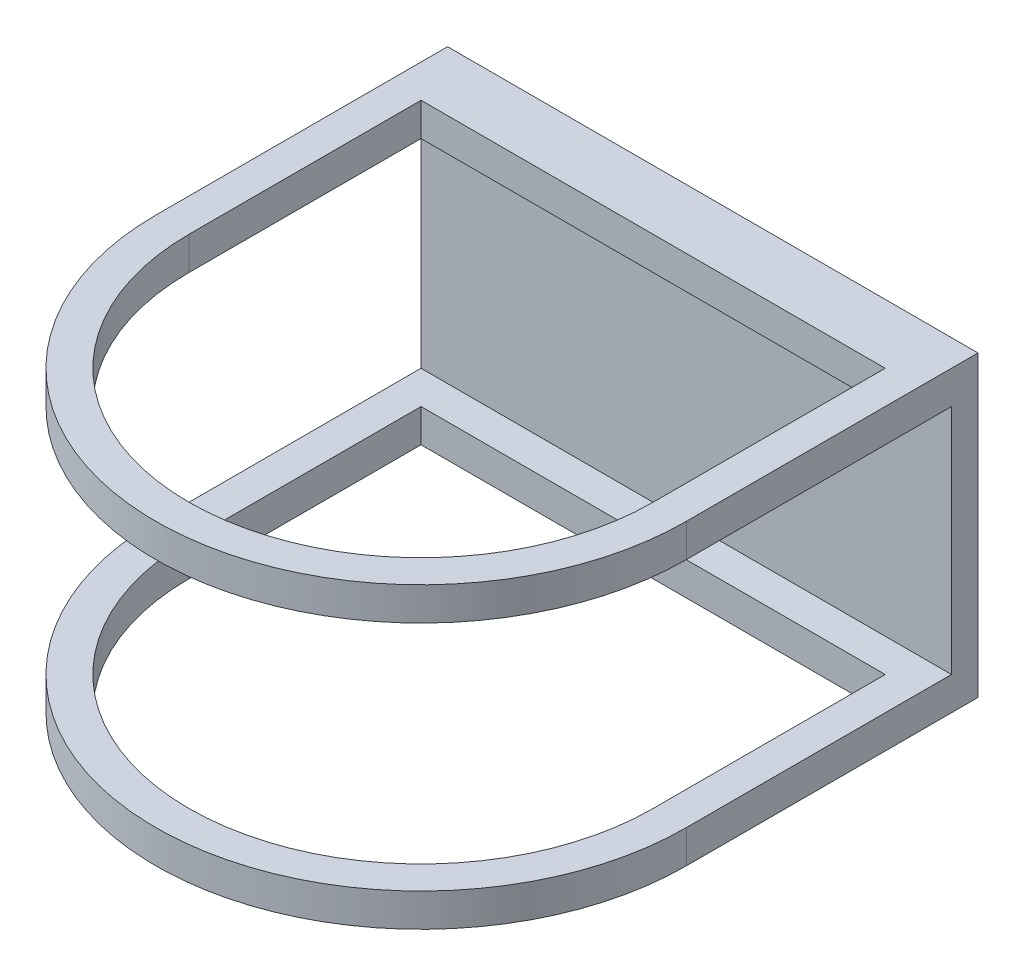
ISO-10303-21;
HEADER;
FILE_DESCRIPTION(('STEP AP214'),'2;1');
FILE_NAME('part.step','',(''),(''),'','','');
FILE_SCHEMA(('AUTOMOTIVE_DESIGN { 1 0 10303 214 1 1 1 1 }'));
ENDSEC;
DATA;
#1=APPLICATION_CONTEXT('core data for automotive mechanical design processes');
#2=APPLICATION_PROTOCOL_DEFINITION('international standard','automotive_design',2000,#1);
#3=PRODUCT_CONTEXT('',#1,'mechanical');
#4=PRODUCT('Part','Part','',(#3));
#5=PRODUCT_RELATED_PRODUCT_CATEGORY('part','',(#4));
#6=PRODUCT_DEFINITION_FORMATION('','',#4);
#7=PRODUCT_DEFINITION_CONTEXT('part definition',#1,'design');
#8=PRODUCT_DEFINITION('design','',#6,#7);
#9=PRODUCT_DEFINITION_SHAPE('','',#8);
#10=(LENGTH_UNIT() NAMED_UNIT(*) SI_UNIT(.MILLI.,.METRE.));
#11=(NAMED_UNIT(*) PLANE_ANGLE_UNIT() SI_UNIT($,.RADIAN.));
#12=(NAMED_UNIT(*) SI_UNIT($,.STERADIAN.) SOLID_ANGLE_UNIT());
#13=UNCERTAINTY_MEASURE_WITH_UNIT(LENGTH_MEASURE(1.E-05),#10,'distance_accuracy_value','');
#14=(GEOMETRIC_REPRESENTATION_CONTEXT(3) GLOBAL_UNCERTAINTY_ASSIGNED_CONTEXT((#13)) GLOBAL_UNIT_ASSIGNED_CONTEXT((#10,
#11,#12)) REPRESENTATION_CONTEXT('',''));
#15=CARTESIAN_POINT('',(0.,0.,0.));
#16=DIRECTION('',(0.,0.,1.));
#17=DIRECTION('',(1.,0.,0.));
#18=AXIS2_PLACEMENT_3D('',#15,#16,#17);
#19=CARTESIAN_POINT('',(0.,0.,-50.8));
#20=DIRECTION('',(0.,0.,-1.));
#21=DIRECTION('',(-1.,0.,0.));
#22=AXIS2_PLACEMENT_3D('',#19,#20,#21);
#23=PLANE('',#22);
#24=DIRECTION('',(1.,0.,0.));
#25=VECTOR('',#24,1.);
#26=CARTESIAN_POINT('',(0.,50.8,-50.8));
#27=LINE('',#26,#25);
#28=CARTESIAN_POINT('',(-50.8,50.8,-50.8));
#29=VERTEX_POINT('',#28);
#30=CARTESIAN_POINT('',(50.8,50.8,-50.8));
#31=VERTEX_POINT('',#30);
#32=EDGE_CURVE('E248',#29,#31,#27,.T.);
#33=ORIENTED_EDGE('',*,*,#32,.F.);
#34=DIRECTION('',(0.,1.,0.));
#35=VECTOR('',#34,1.);
#36=CARTESIAN_POINT('',(-50.8,0.,-50.8));
#37=LINE('',#36,#35);
#38=CARTESIAN_POINT('',(-50.8,6.35,-50.8));
#39=VERTEX_POINT('',#38);
#40=EDGE_CURVE('E193',#39,#29,#37,.T.);
#41=ORIENTED_EDGE('',*,*,#40,.F.);
#42=DIRECTION('',(1.,0.,0.));
#43=VECTOR('',#42,1.);
#44=CARTESIAN_POINT('',(0.,6.35,-50.8));
#45=LINE('',#44,#43);
#46=CARTESIAN_POINT('',(50.8,6.35,-50.8));
#47=VERTEX_POINT('',#46);
#48=EDGE_CURVE('E116',#39,#47,#45,.T.);
#49=ORIENTED_EDGE('',*,*,#48,.T.);
#50=DIRECTION('',(0.,-1.,0.));
#51=VECTOR('',#50,1.);
#52=CARTESIAN_POINT('',(50.8,57.15,-50.8));
#53=LINE('',#52,#51);
#54=EDGE_CURVE('E38',#31,#47,#53,.T.);
#55=ORIENTED_EDGE('',*,*,#54,.F.);
#56=EDGE_LOOP('',(#33,#41,#49,#55));
#57=FACE_BOUND('',#56,.T.);
#58=ADVANCED_FACE('F34',(#57),#23,.F.);
#59=CARTESIAN_POINT('',(0.,0.,-55.88));
#60=DIRECTION('',(0.,0.,-1.));
#61=DIRECTION('',(-1.,0.,0.));
#62=AXIS2_PLACEMENT_3D('',#59,#60,#61);
#63=PLANE('',#62);
#64=CARTESIAN_POINT('',(47.625,53.975,-55.88));
#65=DIRECTION('',(0.,0.,-1.));
#66=DIRECTION('',(-1.,0.,0.));
#67=AXIS2_PLACEMENT_3D('',#64,#65,#66);
#68=CIRCLE('',#67,2.413);
#69=CARTESIAN_POINT('',(45.212,53.975,-55.88));
#70=VERTEX_POINT('',#69);
#71=EDGE_CURVE('E223',#70,#70,#68,.T.);
#72=ORIENTED_EDGE('',*,*,#71,.F.);
#73=EDGE_LOOP('',(#72));
#74=FACE_BOUND('',#73,.T.);
#75=DIRECTION('',(1.,0.,0.));
#76=VECTOR('',#75,1.);
#77=CARTESIAN_POINT('',(-50.8,57.15,-55.88));
#78=LINE('',#77,#76);
#79=CARTESIAN_POINT('',(-50.8,57.15,-55.88));
#80=VERTEX_POINT('',#79);
#81=CARTESIAN_POINT('',(50.8,57.15,-55.88));
#82=VERTEX_POINT('',#81);
#83=EDGE_CURVE('E196',#80,#82,#78,.T.);
#84=ORIENTED_EDGE('',*,*,#83,.T.);
#85=DIRECTION('',(0.,-1.,0.));
#86=VECTOR('',#85,1.);
#87=CARTESIAN_POINT('',(50.8,57.15,-55.88));
#88=LINE('',#87,#86);
#89=CARTESIAN_POINT('',(50.8,0.,-55.88));
#90=VERTEX_POINT('',#89);
#91=EDGE_CURVE('E217',#82,#90,#88,.T.);
#92=ORIENTED_EDGE('',*,*,#91,.T.);
#93=DIRECTION('',(-1.,0.,0.));
#94=VECTOR('',#93,1.);
#95=CARTESIAN_POINT('',(50.8,0.,-55.88));
#96=LINE('',#95,#94);
#97=CARTESIAN_POINT('',(-50.8,0.,-55.88));
#98=VERTEX_POINT('',#97);
#99=EDGE_CURVE('E212',#90,#98,#96,.T.);
#100=ORIENTED_EDGE('',*,*,#99,.T.);
#101=DIRECTION('',(0.,1.,0.));
#102=VECTOR('',#101,1.);
#103=CARTESIAN_POINT('',(-50.8,0.,-55.88));
#104=LINE('',#103,#102);
#105=EDGE_CURVE('E203',#98,#80,#104,.T.);
#106=ORIENTED_EDGE('',*,*,#105,.T.);
#107=EDGE_LOOP('',(#84,#92,#100,#106));
#108=FACE_BOUND('',#107,.T.);
#109=CARTESIAN_POINT('',(-47.625,53.975,-55.88));
#110=DIRECTION('',(0.,0.,-1.));
#111=DIRECTION('',(-1.,0.,0.));
#112=AXIS2_PLACEMENT_3D('',#109,#110,#111);
#113=CIRCLE('',#112,2.413);
#114=CARTESIAN_POINT('',(-50.038,53.975,-55.88));
#115=VERTEX_POINT('',#114);
#116=EDGE_CURVE('E226',#115,#115,#113,.T.);
#117=ORIENTED_EDGE('',*,*,#116,.F.);
#118=EDGE_LOOP('',(#117));
#119=FACE_BOUND('',#118,.T.);
#120=ADVANCED_FACE('F306',(#74,#108,#119),#63,.T.);
#121=CARTESIAN_POINT('',(-50.8,57.15,-55.88));
#122=DIRECTION('',(0.,-1.,0.));
#123=DIRECTION('',(0.,0.,-1.));
#124=AXIS2_PLACEMENT_3D('',#121,#122,#123);
#125=PLANE('',#124);
#126=DIRECTION('',(0.,0.,1.));
#127=VECTOR('',#126,1.);
#128=CARTESIAN_POINT('',(-50.8,57.15,-55.88));
#129=LINE('',#128,#127);
#130=CARTESIAN_POINT('',(-50.8,57.15,0.));
#131=VERTEX_POINT('',#130);
#132=EDGE_CURVE('E201',#80,#131,#129,.T.);
#133=ORIENTED_EDGE('',*,*,#132,.T.);
#134=CARTESIAN_POINT('',(0.,57.15,0.));
#135=DIRECTION('',(0.,1.,0.));
#136=DIRECTION('',(0.,0.,1.));
#137=AXIS2_PLACEMENT_3D('',#134,#135,#136);
#138=CIRCLE('',#137,50.8);
#139=CARTESIAN_POINT('',(50.8,57.15,0.));
#140=VERTEX_POINT('',#139);
#141=EDGE_CURVE('E243',#131,#140,#138,.T.);
#142=ORIENTED_EDGE('',*,*,#141,.T.);
#143=DIRECTION('',(0.,0.,1.));
#144=VECTOR('',#143,1.);
#145=CARTESIAN_POINT('',(50.8,57.15,-55.88));
#146=LINE('',#145,#144);
#147=EDGE_CURVE('E188',#82,#140,#146,.T.);
#148=ORIENTED_EDGE('',*,*,#147,.F.);
#149=ORIENTED_EDGE('',*,*,#83,.F.);
#150=EDGE_LOOP('',(#133,#142,#148,#149));
#151=FACE_BOUND('',#150,.T.);
#152=CARTESIAN_POINT('',(0.,57.15,0.));
#153=DIRECTION('',(0.,1.,0.));
#154=DIRECTION('',(0.,0.,1.));
#155=AXIS2_PLACEMENT_3D('',#152,#153,#154);
#156=CIRCLE('',#155,44.45);
#157=CARTESIAN_POINT('',(-44.45,57.15,0.));
#158=VERTEX_POINT('',#157);
#159=CARTESIAN_POINT('',(44.45,57.15,0.));
#160=VERTEX_POINT('',#159);
#161=EDGE_CURVE('E251',#158,#160,#156,.T.);
#162=ORIENTED_EDGE('',*,*,#161,.F.);
#163=DIRECTION('',(0.,0.,-1.));
#164=VECTOR('',#163,1.);
#165=CARTESIAN_POINT('',(-44.45,57.15,0.));
#166=LINE('',#165,#164);
#167=CARTESIAN_POINT('',(-44.45,57.15,-44.45));
#168=VERTEX_POINT('',#167);
#169=EDGE_CURVE('E281',#158,#168,#166,.T.);
#170=ORIENTED_EDGE('',*,*,#169,.T.);
#171=DIRECTION('',(1.,0.,0.));
#172=VECTOR('',#171,1.);
#173=CARTESIAN_POINT('',(0.,57.15,-44.45));
#174=LINE('',#173,#172);
#175=CARTESIAN_POINT('',(44.45,57.15,-44.45));
#176=VERTEX_POINT('',#175);
#177=EDGE_CURVE('E278',#168,#176,#174,.T.);
#178=ORIENTED_EDGE('',*,*,#177,.T.);
#179=DIRECTION('',(0.,0.,1.));
#180=VECTOR('',#179,1.);
#181=CARTESIAN_POINT('',(44.45,57.15,0.));
#182=LINE('',#181,#180);
#183=EDGE_CURVE('E275',#176,#160,#182,.T.);
#184=ORIENTED_EDGE('',*,*,#183,.T.);
#185=EDGE_LOOP('',(#162,#170,#178,#184));
#186=FACE_BOUND('',#185,.T.);
#187=ADVANCED_FACE('F297',(#151,#186),#125,.F.);
#188=CARTESIAN_POINT('',(47.625,53.975,-55.88));
#189=DIRECTION('',(0.,0.,1.));
#190=DIRECTION('',(1.,0.,0.));
#191=AXIS2_PLACEMENT_3D('',#188,#189,#190);
#192=CYLINDRICAL_SURFACE('',#191,2.413);
#193=ORIENTED_EDGE('',*,*,#71,.T.);
#194=EDGE_LOOP('',(#193));
#195=FACE_BOUND('',#194,.T.);
#196=CARTESIAN_POINT('',(47.625,53.975,-25.4));
#197=DIRECTION('',(0.,0.,-1.));
#198=DIRECTION('',(-1.,0.,0.));
#199=AXIS2_PLACEMENT_3D('',#196,#197,#198);
#200=CIRCLE('',#199,2.41300000000001);
#201=CARTESIAN_POINT('',(45.212,53.975,-25.4));
#202=VERTEX_POINT('',#201);
#203=EDGE_CURVE('E288',#202,#202,#200,.T.);
#204=ORIENTED_EDGE('',*,*,#203,.F.);
#205=EDGE_LOOP('',(#204));
#206=FACE_BOUND('',#205,.T.);
#207=ADVANCED_FACE('F294',(#195,#206),#192,.F.);
#208=CARTESIAN_POINT('',(-47.625,53.975,-55.88));
#209=DIRECTION('',(0.,0.,1.));
#210=DIRECTION('',(1.,0.,0.));
#211=AXIS2_PLACEMENT_3D('',#208,#209,#210);
#212=CYLINDRICAL_SURFACE('',#211,2.413);
#213=ORIENTED_EDGE('',*,*,#116,.T.);
#214=EDGE_LOOP('',(#213));
#215=FACE_BOUND('',#214,.T.);
#216=CARTESIAN_POINT('',(-47.625,53.975,-25.4));
#217=DIRECTION('',(0.,0.,-1.));
#218=DIRECTION('',(-1.,0.,0.));
#219=AXIS2_PLACEMENT_3D('',#216,#217,#218);
#220=CIRCLE('',#219,2.41300000000001);
#221=CARTESIAN_POINT('',(-50.038,53.975,-25.4));
#222=VERTEX_POINT('',#221);
#223=EDGE_CURVE('E273',#222,#222,#220,.T.);
#224=ORIENTED_EDGE('',*,*,#223,.F.);
#225=EDGE_LOOP('',(#224));
#226=FACE_BOUND('',#225,.T.);
#227=ADVANCED_FACE('F296',(#215,#226),#212,.F.);
#228=CARTESIAN_POINT('',(0.,6.35,0.));
#229=DIRECTION('',(0.,-1.,0.));
#230=DIRECTION('',(0.,0.,-1.));
#231=AXIS2_PLACEMENT_3D('',#228,#229,#230);
#232=CYLINDRICAL_SURFACE('',#231,50.8);
#233=CARTESIAN_POINT('',(0.,0.,0.));
#234=DIRECTION('',(0.,1.,0.));
#235=DIRECTION('',(0.,0.,1.));
#236=AXIS2_PLACEMENT_3D('',#233,#234,#235);
#237=CIRCLE('',#236,50.8);
#238=CARTESIAN_POINT('',(-50.8,0.,0.));
#239=VERTEX_POINT('',#238);
#240=CARTESIAN_POINT('',(50.8,0.,0.));
#241=VERTEX_POINT('',#240);
#242=EDGE_CURVE('E145',#239,#241,#237,.T.);
#243=ORIENTED_EDGE('',*,*,#242,.T.);
#244=DIRECTION('',(0.,-1.,0.));
#245=VECTOR('',#244,1.);
#246=CARTESIAN_POINT('',(50.8,6.35,0.));
#247=LINE('',#246,#245);
#248=CARTESIAN_POINT('',(50.8,6.35,0.));
#249=VERTEX_POINT('',#248);
#250=EDGE_CURVE('E46',#249,#241,#247,.T.);
#251=ORIENTED_EDGE('',*,*,#250,.F.);
#252=CARTESIAN_POINT('',(0.,6.35,0.));
#253=DIRECTION('',(0.,1.,0.));
#254=DIRECTION('',(0.,0.,1.));
#255=AXIS2_PLACEMENT_3D('',#252,#253,#254);
#256=CIRCLE('',#255,50.8);
#257=CARTESIAN_POINT('',(-50.8,6.35,0.));
#258=VERTEX_POINT('',#257);
#259=EDGE_CURVE('E108',#258,#249,#256,.T.);
#260=ORIENTED_EDGE('',*,*,#259,.F.);
#261=DIRECTION('',(0.,-1.,0.));
#262=VECTOR('',#261,1.);
#263=CARTESIAN_POINT('',(-50.8,6.35,0.));
#264=LINE('',#263,#262);
#265=EDGE_CURVE('E11',#258,#239,#264,.T.);
#266=ORIENTED_EDGE('',*,*,#265,.T.);
#267=EDGE_LOOP('',(#243,#251,#260,#266));
#268=FACE_BOUND('',#267,.T.);
#269=ADVANCED_FACE('F109',(#268),#232,.T.);
#270=CARTESIAN_POINT('',(44.45,6.35,0.));
#271=DIRECTION('',(1.,0.,0.));
#272=DIRECTION('',(0.,0.,-1.));
#273=AXIS2_PLACEMENT_3D('',#270,#271,#272);
#274=PLANE('',#273);
#275=DIRECTION('',(0.,0.,1.));
#276=VECTOR('',#275,1.);
#277=CARTESIAN_POINT('',(44.45,0.,0.));
#278=LINE('',#277,#276);
#279=CARTESIAN_POINT('',(44.45,0.,-44.45));
#280=VERTEX_POINT('',#279);
#281=CARTESIAN_POINT('',(44.45,0.,0.));
#282=VERTEX_POINT('',#281);
#283=EDGE_CURVE('E141',#280,#282,#278,.T.);
#284=ORIENTED_EDGE('',*,*,#283,.T.);
#285=DIRECTION('',(0.,-1.,0.));
#286=VECTOR('',#285,1.);
#287=CARTESIAN_POINT('',(44.45,6.35,0.));
#288=LINE('',#287,#286);
#289=CARTESIAN_POINT('',(44.45,6.35,0.));
#290=VERTEX_POINT('',#289);
#291=EDGE_CURVE('E129',#290,#282,#288,.T.);
#292=ORIENTED_EDGE('',*,*,#291,.F.);
#293=DIRECTION('',(0.,0.,1.));
#294=VECTOR('',#293,1.);
#295=CARTESIAN_POINT('',(44.45,6.35,0.));
#296=LINE('',#295,#294);
#297=CARTESIAN_POINT('',(44.45,6.35,-44.45));
#298=VERTEX_POINT('',#297);
#299=EDGE_CURVE('E118',#298,#290,#296,.T.);
#300=ORIENTED_EDGE('',*,*,#299,.F.);
#301=DIRECTION('',(0.,-1.,0.));
#302=VECTOR('',#301,1.);
#303=CARTESIAN_POINT('',(44.45,6.35,-44.45));
#304=LINE('',#303,#302);
#305=EDGE_CURVE('E153',#298,#280,#304,.T.);
#306=ORIENTED_EDGE('',*,*,#305,.T.);
#307=EDGE_LOOP('',(#284,#292,#300,#306));
#308=FACE_BOUND('',#307,.T.);
#309=ADVANCED_FACE('F173',(#308),#274,.F.);
#310=CARTESIAN_POINT('',(0.,6.35,-44.45));
#311=DIRECTION('',(0.,0.,-1.));
#312=DIRECTION('',(-1.,0.,0.));
#313=AXIS2_PLACEMENT_3D('',#310,#311,#312);
#314=PLANE('',#313);
#315=DIRECTION('',(1.,0.,0.));
#316=VECTOR('',#315,1.);
#317=CARTESIAN_POINT('',(0.,0.,-44.45));
#318=LINE('',#317,#316);
#319=CARTESIAN_POINT('',(-44.45,0.,-44.45));
#320=VERTEX_POINT('',#319);
#321=EDGE_CURVE('E139',#320,#280,#318,.T.);
#322=ORIENTED_EDGE('',*,*,#321,.T.);
#323=ORIENTED_EDGE('',*,*,#305,.F.);
#324=DIRECTION('',(1.,0.,0.));
#325=VECTOR('',#324,1.);
#326=CARTESIAN_POINT('',(0.,6.35,-44.45));
#327=LINE('',#326,#325);
#328=CARTESIAN_POINT('',(-44.45,6.35,-44.45));
#329=VERTEX_POINT('',#328);
#330=EDGE_CURVE('E120',#329,#298,#327,.T.);
#331=ORIENTED_EDGE('',*,*,#330,.F.);
#332=DIRECTION('',(0.,-1.,0.));
#333=VECTOR('',#332,1.);
#334=CARTESIAN_POINT('',(-44.45,6.35,-44.45));
#335=LINE('',#334,#333);
#336=EDGE_CURVE('E155',#329,#320,#335,.T.);
#337=ORIENTED_EDGE('',*,*,#336,.T.);
#338=EDGE_LOOP('',(#322,#323,#331,#337));
#339=FACE_BOUND('',#338,.T.);
#340=ADVANCED_FACE('F175',(#339),#314,.F.);
#341=CARTESIAN_POINT('',(-44.45,6.35,0.));
#342=DIRECTION('',(-1.,0.,0.));
#343=DIRECTION('',(0.,0.,1.));
#344=AXIS2_PLACEMENT_3D('',#341,#342,#343);
#345=PLANE('',#344);
#346=DIRECTION('',(0.,0.,-1.));
#347=VECTOR('',#346,1.);
#348=CARTESIAN_POINT('',(-44.45,0.,0.));
#349=LINE('',#348,#347);
#350=CARTESIAN_POINT('',(-44.45,0.,0.));
#351=VERTEX_POINT('',#350);
#352=EDGE_CURVE('E136',#351,#320,#349,.T.);
#353=ORIENTED_EDGE('',*,*,#352,.T.);
#354=ORIENTED_EDGE('',*,*,#336,.F.);
#355=DIRECTION('',(0.,0.,-1.));
#356=VECTOR('',#355,1.);
#357=CARTESIAN_POINT('',(-44.45,6.35,0.));
#358=LINE('',#357,#356);
#359=CARTESIAN_POINT('',(-44.45,6.35,0.));
#360=VERTEX_POINT('',#359);
#361=EDGE_CURVE('E164',#360,#329,#358,.T.);
#362=ORIENTED_EDGE('',*,*,#361,.F.);
#363=DIRECTION('',(0.,-1.,0.));
#364=VECTOR('',#363,1.);
#365=CARTESIAN_POINT('',(-44.45,6.35,0.));
#366=LINE('',#365,#364);
#367=EDGE_CURVE('E91',#360,#351,#366,.T.);
#368=ORIENTED_EDGE('',*,*,#367,.T.);
#369=EDGE_LOOP('',(#353,#354,#362,#368));
#370=FACE_BOUND('',#369,.T.);
#371=ADVANCED_FACE('F163',(#370),#345,.F.);
#372=CARTESIAN_POINT('',(0.,6.35,0.));
#373=DIRECTION('',(0.,-1.,0.));
#374=DIRECTION('',(0.,0.,-1.));
#375=AXIS2_PLACEMENT_3D('',#372,#373,#374);
#376=CYLINDRICAL_SURFACE('',#375,44.45);
#377=CARTESIAN_POINT('',(0.,0.,0.));
#378=DIRECTION('',(0.,1.,0.));
#379=DIRECTION('',(0.,0.,1.));
#380=AXIS2_PLACEMENT_3D('',#377,#378,#379);
#381=CIRCLE('',#380,44.45);
#382=EDGE_CURVE('E133',#351,#282,#381,.T.);
#383=ORIENTED_EDGE('',*,*,#382,.F.);
#384=ORIENTED_EDGE('',*,*,#367,.F.);
#385=CARTESIAN_POINT('',(0.,6.35,0.));
#386=DIRECTION('',(0.,1.,0.));
#387=DIRECTION('',(0.,0.,1.));
#388=AXIS2_PLACEMENT_3D('',#385,#386,#387);
#389=CIRCLE('',#388,44.45);
#390=EDGE_CURVE('E150',#360,#290,#389,.T.);
#391=ORIENTED_EDGE('',*,*,#390,.T.);
#392=ORIENTED_EDGE('',*,*,#291,.T.);
#393=EDGE_LOOP('',(#383,#384,#391,#392));
#394=FACE_BOUND('',#393,.T.);
#395=ADVANCED_FACE('F36',(#394),#376,.F.);
#396=CARTESIAN_POINT('',(0.,6.35,0.));
#397=DIRECTION('',(0.,1.,0.));
#398=DIRECTION('',(0.,0.,1.));
#399=AXIS2_PLACEMENT_3D('',#396,#397,#398);
#400=PLANE('',#399);
#401=ORIENTED_EDGE('',*,*,#390,.F.);
#402=ORIENTED_EDGE('',*,*,#361,.T.);
#403=ORIENTED_EDGE('',*,*,#330,.T.);
#404=ORIENTED_EDGE('',*,*,#299,.T.);
#405=EDGE_LOOP('',(#401,#402,#403,#404));
#406=FACE_BOUND('',#405,.T.);
#407=DIRECTION('',(0.,0.,-1.));
#408=VECTOR('',#407,1.);
#409=CARTESIAN_POINT('',(-50.8,6.35,0.));
#410=LINE('',#409,#408);
#411=EDGE_CURVE('E55',#258,#39,#410,.T.);
#412=ORIENTED_EDGE('',*,*,#411,.F.);
#413=ORIENTED_EDGE('',*,*,#259,.T.);
#414=DIRECTION('',(0.,0.,1.));
#415=VECTOR('',#414,1.);
#416=CARTESIAN_POINT('',(50.8,6.35,0.));
#417=LINE('',#416,#415);
#418=EDGE_CURVE('E112',#47,#249,#417,.T.);
#419=ORIENTED_EDGE('',*,*,#418,.F.);
#420=ORIENTED_EDGE('',*,*,#48,.F.);
#421=EDGE_LOOP('',(#412,#413,#419,#420));
#422=FACE_BOUND('',#421,.T.);
#423=ADVANCED_FACE('F114',(#406,#422),#400,.T.);
#424=CARTESIAN_POINT('',(50.8,6.35,0.));
#425=DIRECTION('',(1.,0.,0.));
#426=DIRECTION('',(0.,0.,-1.));
#427=AXIS2_PLACEMENT_3D('',#424,#425,#426);
#428=PLANE('',#427);
#429=DIRECTION('',(0.,0.,1.));
#430=VECTOR('',#429,1.);
#431=CARTESIAN_POINT('',(50.8,0.,0.));
#432=LINE('',#431,#430);
#433=EDGE_CURVE('E147',#90,#241,#432,.T.);
#434=ORIENTED_EDGE('',*,*,#433,.F.);
#435=ORIENTED_EDGE('',*,*,#91,.F.);
#436=ORIENTED_EDGE('',*,*,#147,.T.);
#437=DIRECTION('',(0.,-1.,0.));
#438=VECTOR('',#437,1.);
#439=CARTESIAN_POINT('',(50.8,57.15,0.));
#440=LINE('',#439,#438);
#441=CARTESIAN_POINT('',(50.8,50.8,0.));
#442=VERTEX_POINT('',#441);
#443=EDGE_CURVE('E233',#140,#442,#440,.T.);
#444=ORIENTED_EDGE('',*,*,#443,.T.);
#445=DIRECTION('',(0.,0.,1.));
#446=VECTOR('',#445,1.);
#447=CARTESIAN_POINT('',(50.8,50.8,0.));
#448=LINE('',#447,#446);
#449=EDGE_CURVE('E252',#31,#442,#448,.T.);
#450=ORIENTED_EDGE('',*,*,#449,.F.);
#451=ORIENTED_EDGE('',*,*,#54,.T.);
#452=ORIENTED_EDGE('',*,*,#418,.T.);
#453=ORIENTED_EDGE('',*,*,#250,.T.);
#454=EDGE_LOOP('',(#434,#435,#436,#444,#450,#451,#452,#453));
#455=FACE_BOUND('',#454,.T.);
#456=ADVANCED_FACE('F347',(#455),#428,.T.);
#457=CARTESIAN_POINT('',(-50.8,6.35,0.));
#458=DIRECTION('',(-1.,0.,0.));
#459=DIRECTION('',(0.,0.,1.));
#460=AXIS2_PLACEMENT_3D('',#457,#458,#459);
#461=PLANE('',#460);
#462=DIRECTION('',(0.,0.,-1.));
#463=VECTOR('',#462,1.);
#464=CARTESIAN_POINT('',(-50.8,0.,0.));
#465=LINE('',#464,#463);
#466=EDGE_CURVE('E107',#239,#98,#465,.T.);
#467=ORIENTED_EDGE('',*,*,#466,.F.);
#468=ORIENTED_EDGE('',*,*,#265,.F.);
#469=ORIENTED_EDGE('',*,*,#411,.T.);
#470=ORIENTED_EDGE('',*,*,#40,.T.);
#471=DIRECTION('',(0.,0.,-1.));
#472=VECTOR('',#471,1.);
#473=CARTESIAN_POINT('',(-50.8,50.8,0.));
#474=LINE('',#473,#472);
#475=CARTESIAN_POINT('',(-50.8,50.8,0.));
#476=VERTEX_POINT('',#475);
#477=EDGE_CURVE('E258',#476,#29,#474,.T.);
#478=ORIENTED_EDGE('',*,*,#477,.F.);
#479=DIRECTION('',(0.,-1.,0.));
#480=VECTOR('',#479,1.);
#481=CARTESIAN_POINT('',(-50.8,57.15,0.));
#482=LINE('',#481,#480);
#483=EDGE_CURVE('E229',#131,#476,#482,.T.);
#484=ORIENTED_EDGE('',*,*,#483,.F.);
#485=ORIENTED_EDGE('',*,*,#132,.F.);
#486=ORIENTED_EDGE('',*,*,#105,.F.);
#487=EDGE_LOOP('',(#467,#468,#469,#470,#478,#484,#485,#486));
#488=FACE_BOUND('',#487,.T.);
#489=ADVANCED_FACE('F104',(#488),#461,.T.);
#490=CARTESIAN_POINT('',(0.,0.,0.));
#491=DIRECTION('',(0.,1.,0.));
#492=DIRECTION('',(0.,0.,1.));
#493=AXIS2_PLACEMENT_3D('',#490,#491,#492);
#494=PLANE('',#493);
#495=ORIENTED_EDGE('',*,*,#382,.T.);
#496=ORIENTED_EDGE('',*,*,#283,.F.);
#497=ORIENTED_EDGE('',*,*,#321,.F.);
#498=ORIENTED_EDGE('',*,*,#352,.F.);
#499=EDGE_LOOP('',(#495,#496,#497,#498));
#500=FACE_BOUND('',#499,.T.);
#501=ORIENTED_EDGE('',*,*,#466,.T.);
#502=ORIENTED_EDGE('',*,*,#99,.F.);
#503=ORIENTED_EDGE('',*,*,#433,.T.);
#504=ORIENTED_EDGE('',*,*,#242,.F.);
#505=EDGE_LOOP('',(#501,#502,#503,#504));
#506=FACE_BOUND('',#505,.T.);
#507=ADVANCED_FACE('F167',(#500,#506),#494,.F.);
#508=CARTESIAN_POINT('',(0.,50.8,0.));
#509=DIRECTION('',(0.,1.,0.));
#510=DIRECTION('',(0.,0.,1.));
#511=AXIS2_PLACEMENT_3D('',#508,#509,#510);
#512=PLANE('',#511);
#513=CARTESIAN_POINT('',(0.,50.8,0.));
#514=DIRECTION('',(0.,1.,0.));
#515=DIRECTION('',(0.,0.,1.));
#516=AXIS2_PLACEMENT_3D('',#513,#514,#515);
#517=CIRCLE('',#516,44.45);
#518=CARTESIAN_POINT('',(-44.45,50.8,0.));
#519=VERTEX_POINT('',#518);
#520=CARTESIAN_POINT('',(44.45,50.8,0.));
#521=VERTEX_POINT('',#520);
#522=EDGE_CURVE('E270',#519,#521,#517,.T.);
#523=ORIENTED_EDGE('',*,*,#522,.T.);
#524=DIRECTION('',(0.,0.,1.));
#525=VECTOR('',#524,1.);
#526=CARTESIAN_POINT('',(44.45,50.8,0.));
#527=LINE('',#526,#525);
#528=CARTESIAN_POINT('',(44.45,50.8,-44.45));
#529=VERTEX_POINT('',#528);
#530=EDGE_CURVE('E261',#529,#521,#527,.T.);
#531=ORIENTED_EDGE('',*,*,#530,.F.);
#532=DIRECTION('',(1.,0.,0.));
#533=VECTOR('',#532,1.);
#534=CARTESIAN_POINT('',(0.,50.8,-44.45));
#535=LINE('',#534,#533);
#536=CARTESIAN_POINT('',(-44.45,50.8,-44.45));
#537=VERTEX_POINT('',#536);
#538=EDGE_CURVE('E264',#537,#529,#535,.T.);
#539=ORIENTED_EDGE('',*,*,#538,.F.);
#540=DIRECTION('',(0.,0.,-1.));
#541=VECTOR('',#540,1.);
#542=CARTESIAN_POINT('',(-44.45,50.8,0.));
#543=LINE('',#542,#541);
#544=EDGE_CURVE('E267',#519,#537,#543,.T.);
#545=ORIENTED_EDGE('',*,*,#544,.F.);
#546=EDGE_LOOP('',(#523,#531,#539,#545));
#547=FACE_BOUND('',#546,.T.);
#548=ORIENTED_EDGE('',*,*,#477,.T.);
#549=ORIENTED_EDGE('',*,*,#32,.T.);
#550=ORIENTED_EDGE('',*,*,#449,.T.);
#551=CARTESIAN_POINT('',(0.,50.8,0.));
#552=DIRECTION('',(0.,1.,0.));
#553=DIRECTION('',(0.,0.,1.));
#554=AXIS2_PLACEMENT_3D('',#551,#552,#553);
#555=CIRCLE('',#554,50.8);
#556=EDGE_CURVE('E255',#476,#442,#555,.T.);
#557=ORIENTED_EDGE('',*,*,#556,.F.);
#558=EDGE_LOOP('',(#548,#549,#550,#557));
#559=FACE_BOUND('',#558,.T.);
#560=ADVANCED_FACE('F350',(#547,#559),#512,.F.);
#561=CARTESIAN_POINT('',(44.45,57.15,0.));
#562=DIRECTION('',(1.,0.,0.));
#563=DIRECTION('',(0.,0.,-1.));
#564=AXIS2_PLACEMENT_3D('',#561,#562,#563);
#565=PLANE('',#564);
#566=ORIENTED_EDGE('',*,*,#530,.T.);
#567=DIRECTION('',(0.,-1.,0.));
#568=VECTOR('',#567,1.);
#569=CARTESIAN_POINT('',(44.45,57.15,0.));
#570=LINE('',#569,#568);
#571=EDGE_CURVE('E240',#160,#521,#570,.T.);
#572=ORIENTED_EDGE('',*,*,#571,.F.);
#573=ORIENTED_EDGE('',*,*,#183,.F.);
#574=DIRECTION('',(0.,-1.,0.));
#575=VECTOR('',#574,1.);
#576=CARTESIAN_POINT('',(44.45,57.15,-44.45));
#577=LINE('',#576,#575);
#578=EDGE_CURVE('E237',#176,#529,#577,.T.);
#579=ORIENTED_EDGE('',*,*,#578,.T.);
#580=EDGE_LOOP('',(#566,#572,#573,#579));
#581=FACE_BOUND('',#580,.T.);
#582=ADVANCED_FACE('F390',(#581),#565,.F.);
#583=CARTESIAN_POINT('',(0.,57.15,-44.45));
#584=DIRECTION('',(0.,0.,-1.));
#585=DIRECTION('',(-1.,0.,0.));
#586=AXIS2_PLACEMENT_3D('',#583,#584,#585);
#587=PLANE('',#586);
#588=ORIENTED_EDGE('',*,*,#538,.T.);
#589=ORIENTED_EDGE('',*,*,#578,.F.);
#590=ORIENTED_EDGE('',*,*,#177,.F.);
#591=DIRECTION('',(0.,-1.,0.));
#592=VECTOR('',#591,1.);
#593=CARTESIAN_POINT('',(-44.45,57.15,-44.45));
#594=LINE('',#593,#592);
#595=EDGE_CURVE('E234',#168,#537,#594,.T.);
#596=ORIENTED_EDGE('',*,*,#595,.T.);
#597=EDGE_LOOP('',(#588,#589,#590,#596));
#598=FACE_BOUND('',#597,.T.);
#599=ADVANCED_FACE('F398',(#598),#587,.F.);
#600=CARTESIAN_POINT('',(-44.45,57.15,0.));
#601=DIRECTION('',(-1.,0.,0.));
#602=DIRECTION('',(0.,0.,1.));
#603=AXIS2_PLACEMENT_3D('',#600,#601,#602);
#604=PLANE('',#603);
#605=ORIENTED_EDGE('',*,*,#544,.T.);
#606=ORIENTED_EDGE('',*,*,#595,.F.);
#607=ORIENTED_EDGE('',*,*,#169,.F.);
#608=DIRECTION('',(0.,-1.,0.));
#609=VECTOR('',#608,1.);
#610=CARTESIAN_POINT('',(-44.45,57.15,0.));
#611=LINE('',#610,#609);
#612=EDGE_CURVE('E230',#158,#519,#611,.T.);
#613=ORIENTED_EDGE('',*,*,#612,.T.);
#614=EDGE_LOOP('',(#605,#606,#607,#613));
#615=FACE_BOUND('',#614,.T.);
#616=ADVANCED_FACE('F406',(#615),#604,.F.);
#617=CARTESIAN_POINT('',(0.,57.15,0.));
#618=DIRECTION('',(0.,-1.,0.));
#619=DIRECTION('',(0.,0.,-1.));
#620=AXIS2_PLACEMENT_3D('',#617,#618,#619);
#621=CYLINDRICAL_SURFACE('',#620,44.45);
#622=ORIENTED_EDGE('',*,*,#522,.F.);
#623=ORIENTED_EDGE('',*,*,#612,.F.);
#624=ORIENTED_EDGE('',*,*,#161,.T.);
#625=ORIENTED_EDGE('',*,*,#571,.T.);
#626=EDGE_LOOP('',(#622,#623,#624,#625));
#627=FACE_BOUND('',#626,.T.);
#628=ADVANCED_FACE('F414',(#627),#621,.F.);
#629=CARTESIAN_POINT('',(0.,57.15,0.));
#630=DIRECTION('',(0.,-1.,0.));
#631=DIRECTION('',(0.,0.,-1.));
#632=AXIS2_PLACEMENT_3D('',#629,#630,#631);
#633=CYLINDRICAL_SURFACE('',#632,50.8);
#634=ORIENTED_EDGE('',*,*,#556,.T.);
#635=ORIENTED_EDGE('',*,*,#443,.F.);
#636=ORIENTED_EDGE('',*,*,#141,.F.);
#637=ORIENTED_EDGE('',*,*,#483,.T.);
#638=EDGE_LOOP('',(#634,#635,#636,#637));
#639=FACE_BOUND('',#638,.T.);
#640=ADVANCED_FACE('F422',(#639),#633,.T.);
#641=CARTESIAN_POINT('',(-47.625,53.975,-25.4));
#642=DIRECTION('',(0.,0.,1.));
#643=DIRECTION('',(1.,0.,0.));
#644=AXIS2_PLACEMENT_3D('',#641,#642,#643);
#645=PLANE('',#644);
#646=ORIENTED_EDGE('',*,*,#223,.T.);
#647=EDGE_LOOP('',(#646));
#648=FACE_BOUND('',#647,.T.);
#649=ADVANCED_FACE('F430',(#648),#645,.F.);
#650=CARTESIAN_POINT('',(47.625,53.975,-25.4));
#651=DIRECTION('',(0.,0.,1.));
#652=DIRECTION('',(1.,0.,0.));
#653=AXIS2_PLACEMENT_3D('',#650,#651,#652);
#654=PLANE('',#653);
#655=ORIENTED_EDGE('',*,*,#203,.T.);
#656=EDGE_LOOP('',(#655));
#657=FACE_BOUND('',#656,.T.);
#658=ADVANCED_FACE('F292',(#657),#654,.F.);
#659=CLOSED_SHELL('',(#58,#120,#187,#207,#227,#269,#309,#340,#371,#395,#423,#456,#489,#507,#560,
#582,#599,#616,#628,#640,#649,#658));
#660=CARTESIAN_POINT('',(-47.625,3.175,-25.4));
#661=DIRECTION('',(0.,0.,1.));
#662=DIRECTION('',(1.,0.,0.));
#663=AXIS2_PLACEMENT_3D('',#660,#661,#662);
#664=PLANE('',#663);
#665=CARTESIAN_POINT('',(-47.625,3.175,-25.4));
#666=DIRECTION('',(0.,0.,-1.));
#667=DIRECTION('',(-1.,0.,0.));
#668=AXIS2_PLACEMENT_3D('',#665,#666,#667);
#669=CIRCLE('',#668,2.41300000000001);
#670=CARTESIAN_POINT('',(-50.038,3.175,-25.4));
#671=VERTEX_POINT('',#670);
#672=EDGE_CURVE('E137',#671,#671,#669,.T.);
#673=ORIENTED_EDGE('',*,*,#672,.T.);
#674=EDGE_LOOP('',(#673));
#675=FACE_BOUND('',#674,.T.);
#676=ADVANCED_FACE('F332',(#675),#664,.F.);
#677=CARTESIAN_POINT('',(-47.625,3.175,-50.8));
#678=DIRECTION('',(0.,0.,-1.));
#679=DIRECTION('',(-1.,0.,0.));
#680=AXIS2_PLACEMENT_3D('',#677,#678,#679);
#681=CYLINDRICAL_SURFACE('',#680,2.41300000000001);
#682=ORIENTED_EDGE('',*,*,#672,.F.);
#683=EDGE_LOOP('',(#682));
#684=FACE_BOUND('',#683,.T.);
#685=CARTESIAN_POINT('',(-47.625,3.175,-50.8));
#686=DIRECTION('',(0.,0.,-1.));
#687=DIRECTION('',(-1.,0.,0.));
#688=AXIS2_PLACEMENT_3D('',#685,#686,#687);
#689=CIRCLE('',#688,2.41300000000001);
#690=CARTESIAN_POINT('',(-50.038,3.175,-50.8));
#691=VERTEX_POINT('',#690);
#692=EDGE_CURVE('E184',#691,#691,#689,.T.);
#693=ORIENTED_EDGE('',*,*,#692,.T.);
#694=EDGE_LOOP('',(#693));
#695=FACE_BOUND('',#694,.T.);
#696=ADVANCED_FACE('F325',(#684,#695),#681,.F.);
#697=ORIENTED_EDGE('',*,*,#692,.F.);
#698=EDGE_LOOP('',(#697));
#699=FACE_BOUND('',#698,.T.);
#700=ADVANCED_FACE('F313',(#699),#23,.F.);
#701=CLOSED_SHELL('',(#676,#696,#700));
#702=CARTESIAN_POINT('',(47.625,3.175,-25.4));
#703=DIRECTION('',(0.,0.,1.));
#704=DIRECTION('',(1.,0.,0.));
#705=AXIS2_PLACEMENT_3D('',#702,#703,#704);
#706=PLANE('',#705);
#707=CARTESIAN_POINT('',(47.625,3.175,-25.4));
#708=DIRECTION('',(0.,0.,-1.));
#709=DIRECTION('',(-1.,0.,0.));
#710=AXIS2_PLACEMENT_3D('',#707,#708,#709);
#711=CIRCLE('',#710,2.41300000000001);
#712=CARTESIAN_POINT('',(45.212,3.175,-25.4));
#713=VERTEX_POINT('',#712);
#714=EDGE_CURVE('E183',#713,#713,#711,.T.);
#715=ORIENTED_EDGE('',*,*,#714,.T.);
#716=EDGE_LOOP('',(#715));
#717=FACE_BOUND('',#716,.T.);
#718=ADVANCED_FACE('F462',(#717),#706,.F.);
#719=CARTESIAN_POINT('',(47.625,3.175,-50.8));
#720=DIRECTION('',(0.,0.,-1.));
#721=DIRECTION('',(-1.,0.,0.));
#722=AXIS2_PLACEMENT_3D('',#719,#720,#721);
#723=CYLINDRICAL_SURFACE('',#722,2.41300000000001);
#724=ORIENTED_EDGE('',*,*,#714,.F.);
#725=EDGE_LOOP('',(#724));
#726=FACE_BOUND('',#725,.T.);
#727=CARTESIAN_POINT('',(47.625,3.175,-50.8));
#728=DIRECTION('',(0.,0.,-1.));
#729=DIRECTION('',(-1.,0.,0.));
#730=AXIS2_PLACEMENT_3D('',#727,#728,#729);
#731=CIRCLE('',#730,2.41300000000001);
#732=CARTESIAN_POINT('',(45.212,3.175,-50.8));
#733=VERTEX_POINT('',#732);
#734=EDGE_CURVE('E187',#733,#733,#731,.T.);
#735=ORIENTED_EDGE('',*,*,#734,.T.);
#736=EDGE_LOOP('',(#735));
#737=FACE_BOUND('',#736,.T.);
#738=ADVANCED_FACE('F320',(#726,#737),#723,.F.);
#739=ORIENTED_EDGE('',*,*,#734,.F.);
#740=EDGE_LOOP('',(#739));
#741=FACE_BOUND('',#740,.T.);
#742=ADVANCED_FACE('F312',(#741),#23,.F.);
#743=CLOSED_SHELL('',(#718,#738,#742));
#744=ORIENTED_CLOSED_SHELL('',*,#701,.T.);
#745=ORIENTED_CLOSED_SHELL('',*,#743,.T.);
#746=BREP_WITH_VOIDS('B2',#659,(#744,#745));
#747=ADVANCED_BREP_SHAPE_REPRESENTATION('',(#18,#746),#14);
#748=SHAPE_DEFINITION_REPRESENTATION(#9,#747);
ENDSEC;
END-ISO-10303-21;
